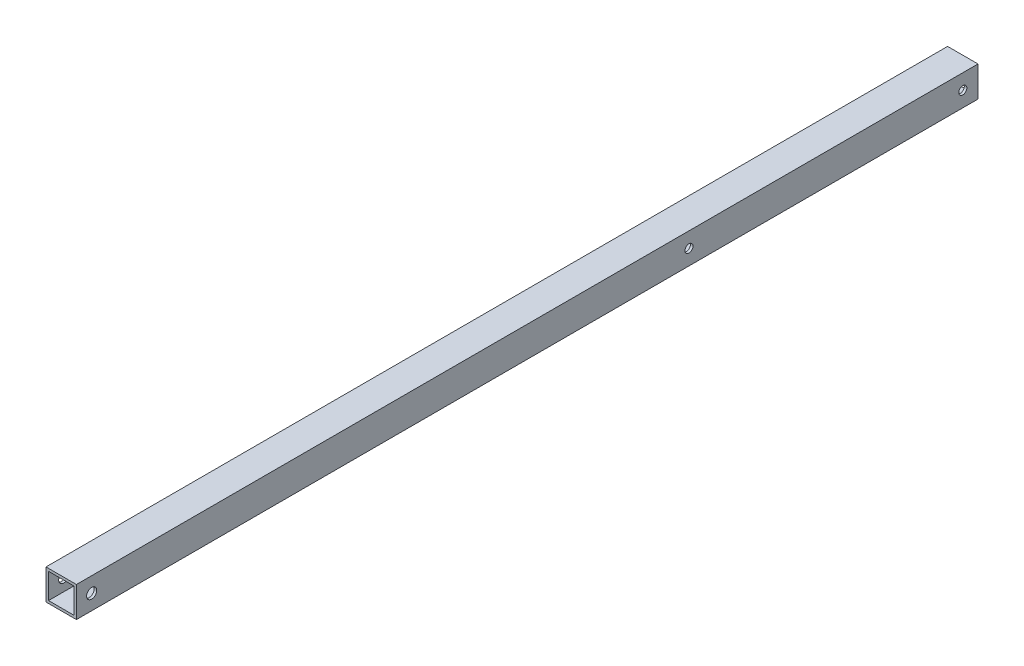
ISO-10303-21;
HEADER;
FILE_DESCRIPTION(('STEP AP214'),'2;1');
FILE_NAME('part.step','',(''),(''),'','','');
FILE_SCHEMA(('AUTOMOTIVE_DESIGN { 1 0 10303 214 1 1 1 1 }'));
ENDSEC;
DATA;
#1=APPLICATION_CONTEXT('core data for automotive mechanical design processes');
#2=APPLICATION_PROTOCOL_DEFINITION('international standard','automotive_design',2000,#1);
#3=PRODUCT_CONTEXT('',#1,'mechanical');
#4=PRODUCT('Part','Part','',(#3));
#5=PRODUCT_RELATED_PRODUCT_CATEGORY('part','',(#4));
#6=PRODUCT_DEFINITION_FORMATION('','',#4);
#7=PRODUCT_DEFINITION_CONTEXT('part definition',#1,'design');
#8=PRODUCT_DEFINITION('design','',#6,#7);
#9=PRODUCT_DEFINITION_SHAPE('','',#8);
#10=(LENGTH_UNIT() NAMED_UNIT(*) SI_UNIT(.MILLI.,.METRE.));
#11=(NAMED_UNIT(*) PLANE_ANGLE_UNIT() SI_UNIT($,.RADIAN.));
#12=(NAMED_UNIT(*) SI_UNIT($,.STERADIAN.) SOLID_ANGLE_UNIT());
#13=UNCERTAINTY_MEASURE_WITH_UNIT(LENGTH_MEASURE(1.E-05),#10,'distance_accuracy_value','');
#14=(GEOMETRIC_REPRESENTATION_CONTEXT(3) GLOBAL_UNCERTAINTY_ASSIGNED_CONTEXT((#13)) GLOBAL_UNIT_ASSIGNED_CONTEXT((#10,
#11,#12)) REPRESENTATION_CONTEXT('',''));
#15=CARTESIAN_POINT('',(0.,0.,0.));
#16=DIRECTION('',(0.,0.,1.));
#17=DIRECTION('',(1.,0.,0.));
#18=AXIS2_PLACEMENT_3D('',#15,#16,#17);
#19=CARTESIAN_POINT('',(0.,0.,1129.03));
#20=DIRECTION('',(0.,0.,-1.));
#21=DIRECTION('',(-1.,0.,0.));
#22=AXIS2_PLACEMENT_3D('',#19,#20,#21);
#23=PLANE('',#22);
#24=DIRECTION('',(0.,-1.,0.));
#25=VECTOR('',#24,1.);
#26=CARTESIAN_POINT('',(0.,0.,1129.03));
#27=LINE('',#26,#25);
#28=CARTESIAN_POINT('',(0.,38.1,1129.03));
#29=VERTEX_POINT('',#28);
#30=CARTESIAN_POINT('',(0.,0.,1129.03));
#31=VERTEX_POINT('',#30);
#32=EDGE_CURVE('E138',#29,#31,#27,.T.);
#33=ORIENTED_EDGE('',*,*,#32,.T.);
#34=DIRECTION('',(1.,0.,0.));
#35=VECTOR('',#34,1.);
#36=CARTESIAN_POINT('',(0.,0.,1129.03));
#37=LINE('',#36,#35);
#38=CARTESIAN_POINT('',(38.1,0.,1129.03));
#39=VERTEX_POINT('',#38);
#40=EDGE_CURVE('E141',#31,#39,#37,.T.);
#41=ORIENTED_EDGE('',*,*,#40,.T.);
#42=DIRECTION('',(0.,1.,0.));
#43=VECTOR('',#42,1.);
#44=CARTESIAN_POINT('',(38.1,0.,1129.03));
#45=LINE('',#44,#43);
#46=CARTESIAN_POINT('',(38.1,38.1,1129.03));
#47=VERTEX_POINT('',#46);
#48=EDGE_CURVE('E144',#39,#47,#45,.T.);
#49=ORIENTED_EDGE('',*,*,#48,.T.);
#50=DIRECTION('',(-1.,0.,0.));
#51=VECTOR('',#50,1.);
#52=CARTESIAN_POINT('',(0.,38.1,1129.03));
#53=LINE('',#52,#51);
#54=EDGE_CURVE('E146',#47,#29,#53,.T.);
#55=ORIENTED_EDGE('',*,*,#54,.T.);
#56=EDGE_LOOP('',(#33,#41,#49,#55));
#57=FACE_BOUND('',#56,.T.);
#58=DIRECTION('',(0.,-1.,0.));
#59=VECTOR('',#58,1.);
#60=CARTESIAN_POINT('',(3.175,3.175,1129.03));
#61=LINE('',#60,#59);
#62=CARTESIAN_POINT('',(3.175,34.925,1129.03));
#63=VERTEX_POINT('',#62);
#64=CARTESIAN_POINT('',(3.175,3.175,1129.03));
#65=VERTEX_POINT('',#64);
#66=EDGE_CURVE('E100',#63,#65,#61,.T.);
#67=ORIENTED_EDGE('',*,*,#66,.F.);
#68=DIRECTION('',(-1.,0.,0.));
#69=VECTOR('',#68,1.);
#70=CARTESIAN_POINT('',(3.175,34.925,1129.03));
#71=LINE('',#70,#69);
#72=CARTESIAN_POINT('',(34.925,34.925,1129.03));
#73=VERTEX_POINT('',#72);
#74=EDGE_CURVE('E122',#73,#63,#71,.T.);
#75=ORIENTED_EDGE('',*,*,#74,.F.);
#76=DIRECTION('',(0.,1.,0.));
#77=VECTOR('',#76,1.);
#78=CARTESIAN_POINT('',(34.925,3.175,1129.03));
#79=LINE('',#78,#77);
#80=CARTESIAN_POINT('',(34.925,3.175,1129.03));
#81=VERTEX_POINT('',#80);
#82=EDGE_CURVE('E120',#81,#73,#79,.T.);
#83=ORIENTED_EDGE('',*,*,#82,.F.);
#84=DIRECTION('',(1.,0.,0.));
#85=VECTOR('',#84,1.);
#86=CARTESIAN_POINT('',(3.175,3.175,1129.03));
#87=LINE('',#86,#85);
#88=EDGE_CURVE('E108',#65,#81,#87,.T.);
#89=ORIENTED_EDGE('',*,*,#88,.F.);
#90=EDGE_LOOP('',(#67,#75,#83,#89));
#91=FACE_BOUND('',#90,.T.);
#92=ADVANCED_FACE('F33',(#57,#91),#23,.F.);
#93=CARTESIAN_POINT('',(0.,0.,0.));
#94=DIRECTION('',(0.,0.,-1.));
#95=DIRECTION('',(-1.,0.,0.));
#96=AXIS2_PLACEMENT_3D('',#93,#94,#95);
#97=PLANE('',#96);
#98=DIRECTION('',(0.,-1.,0.));
#99=VECTOR('',#98,1.);
#100=CARTESIAN_POINT('',(0.,0.,0.));
#101=LINE('',#100,#99);
#102=CARTESIAN_POINT('',(0.,38.1,0.));
#103=VERTEX_POINT('',#102);
#104=CARTESIAN_POINT('',(0.,0.,0.));
#105=VERTEX_POINT('',#104);
#106=EDGE_CURVE('E116',#103,#105,#101,.T.);
#107=ORIENTED_EDGE('',*,*,#106,.F.);
#108=DIRECTION('',(-1.,0.,0.));
#109=VECTOR('',#108,1.);
#110=CARTESIAN_POINT('',(0.,38.1,0.));
#111=LINE('',#110,#109);
#112=CARTESIAN_POINT('',(38.1,38.1,0.));
#113=VERTEX_POINT('',#112);
#114=EDGE_CURVE('E142',#113,#103,#111,.T.);
#115=ORIENTED_EDGE('',*,*,#114,.F.);
#116=DIRECTION('',(0.,1.,0.));
#117=VECTOR('',#116,1.);
#118=CARTESIAN_POINT('',(38.1,0.,0.));
#119=LINE('',#118,#117);
#120=CARTESIAN_POINT('',(38.1,0.,0.));
#121=VERTEX_POINT('',#120);
#122=EDGE_CURVE('E153',#121,#113,#119,.T.);
#123=ORIENTED_EDGE('',*,*,#122,.F.);
#124=DIRECTION('',(1.,0.,0.));
#125=VECTOR('',#124,1.);
#126=CARTESIAN_POINT('',(0.,0.,0.));
#127=LINE('',#126,#125);
#128=EDGE_CURVE('E151',#105,#121,#127,.T.);
#129=ORIENTED_EDGE('',*,*,#128,.F.);
#130=EDGE_LOOP('',(#107,#115,#123,#129));
#131=FACE_BOUND('',#130,.T.);
#132=DIRECTION('',(-1.,0.,0.));
#133=VECTOR('',#132,1.);
#134=CARTESIAN_POINT('',(3.175,34.925,0.));
#135=LINE('',#134,#133);
#136=CARTESIAN_POINT('',(34.925,34.925,0.));
#137=VERTEX_POINT('',#136);
#138=CARTESIAN_POINT('',(3.175,34.925,0.));
#139=VERTEX_POINT('',#138);
#140=EDGE_CURVE('E109',#137,#139,#135,.T.);
#141=ORIENTED_EDGE('',*,*,#140,.T.);
#142=DIRECTION('',(0.,-1.,0.));
#143=VECTOR('',#142,1.);
#144=CARTESIAN_POINT('',(3.175,3.175,0.));
#145=LINE('',#144,#143);
#146=CARTESIAN_POINT('',(3.175,3.175,0.));
#147=VERTEX_POINT('',#146);
#148=EDGE_CURVE('E58',#139,#147,#145,.T.);
#149=ORIENTED_EDGE('',*,*,#148,.T.);
#150=DIRECTION('',(1.,0.,0.));
#151=VECTOR('',#150,1.);
#152=CARTESIAN_POINT('',(3.175,3.175,0.));
#153=LINE('',#152,#151);
#154=CARTESIAN_POINT('',(34.925,3.175,0.));
#155=VERTEX_POINT('',#154);
#156=EDGE_CURVE('E115',#147,#155,#153,.T.);
#157=ORIENTED_EDGE('',*,*,#156,.T.);
#158=DIRECTION('',(0.,1.,0.));
#159=VECTOR('',#158,1.);
#160=CARTESIAN_POINT('',(34.925,3.175,0.));
#161=LINE('',#160,#159);
#162=EDGE_CURVE('E130',#155,#137,#161,.T.);
#163=ORIENTED_EDGE('',*,*,#162,.T.);
#164=EDGE_LOOP('',(#141,#149,#157,#163));
#165=FACE_BOUND('',#164,.T.);
#166=ADVANCED_FACE('F211',(#131,#165),#97,.T.);
#167=CARTESIAN_POINT('',(0.,0.,1129.03));
#168=DIRECTION('',(1.,0.,0.));
#169=DIRECTION('',(0.,0.,-1.));
#170=AXIS2_PLACEMENT_3D('',#167,#168,#169);
#171=PLANE('',#170);
#172=CARTESIAN_POINT('',(0.,19.05,1109.98));
#173=DIRECTION('',(-1.,0.,0.));
#174=DIRECTION('',(0.,0.,1.));
#175=AXIS2_PLACEMENT_3D('',#172,#173,#174);
#176=CIRCLE('',#175,6.34999999999999);
#177=CARTESIAN_POINT('',(0.,19.05,1116.33));
#178=VERTEX_POINT('',#177);
#179=EDGE_CURVE('E275',#178,#178,#176,.T.);
#180=ORIENTED_EDGE('',*,*,#179,.F.);
#181=EDGE_LOOP('',(#180));
#182=FACE_BOUND('',#181,.T.);
#183=CARTESIAN_POINT('',(0.,19.05,19.05));
#184=DIRECTION('',(-1.,0.,0.));
#185=DIRECTION('',(0.,0.,1.));
#186=AXIS2_PLACEMENT_3D('',#183,#184,#185);
#187=CIRCLE('',#186,5.04189999999999);
#188=CARTESIAN_POINT('',(0.,19.05,24.0919));
#189=VERTEX_POINT('',#188);
#190=EDGE_CURVE('E176',#189,#189,#187,.T.);
#191=ORIENTED_EDGE('',*,*,#190,.F.);
#192=EDGE_LOOP('',(#191));
#193=FACE_BOUND('',#192,.T.);
#194=CARTESIAN_POINT('',(0.,19.05,361.95));
#195=DIRECTION('',(-1.,0.,0.));
#196=DIRECTION('',(0.,0.,1.));
#197=AXIS2_PLACEMENT_3D('',#194,#195,#196);
#198=CIRCLE('',#197,5.04189999999999);
#199=CARTESIAN_POINT('',(0.,19.05,366.9919));
#200=VERTEX_POINT('',#199);
#201=EDGE_CURVE('E173',#200,#200,#198,.T.);
#202=ORIENTED_EDGE('',*,*,#201,.F.);
#203=EDGE_LOOP('',(#202));
#204=FACE_BOUND('',#203,.T.);
#205=ORIENTED_EDGE('',*,*,#106,.T.);
#206=DIRECTION('',(0.,0.,-1.));
#207=VECTOR('',#206,1.);
#208=CARTESIAN_POINT('',(0.,0.,1129.03));
#209=LINE('',#208,#207);
#210=EDGE_CURVE('E11',#31,#105,#209,.T.);
#211=ORIENTED_EDGE('',*,*,#210,.F.);
#212=ORIENTED_EDGE('',*,*,#32,.F.);
#213=DIRECTION('',(0.,0.,-1.));
#214=VECTOR('',#213,1.);
#215=CARTESIAN_POINT('',(0.,38.1,1129.03));
#216=LINE('',#215,#214);
#217=EDGE_CURVE('E148',#29,#103,#216,.T.);
#218=ORIENTED_EDGE('',*,*,#217,.T.);
#219=EDGE_LOOP('',(#205,#211,#212,#218));
#220=FACE_BOUND('',#219,.T.);
#221=ADVANCED_FACE('F35',(#182,#193,#204,#220),#171,.F.);
#222=CARTESIAN_POINT('',(0.,0.,1129.03));
#223=DIRECTION('',(0.,1.,0.));
#224=DIRECTION('',(0.,0.,1.));
#225=AXIS2_PLACEMENT_3D('',#222,#223,#224);
#226=PLANE('',#225);
#227=ORIENTED_EDGE('',*,*,#128,.T.);
#228=DIRECTION('',(0.,0.,-1.));
#229=VECTOR('',#228,1.);
#230=CARTESIAN_POINT('',(38.1,0.,1129.03));
#231=LINE('',#230,#229);
#232=EDGE_CURVE('E42',#39,#121,#231,.T.);
#233=ORIENTED_EDGE('',*,*,#232,.F.);
#234=ORIENTED_EDGE('',*,*,#40,.F.);
#235=ORIENTED_EDGE('',*,*,#210,.T.);
#236=EDGE_LOOP('',(#227,#233,#234,#235));
#237=FACE_BOUND('',#236,.T.);
#238=ADVANCED_FACE('F220',(#237),#226,.F.);
#239=CARTESIAN_POINT('',(38.1,0.,1129.03));
#240=DIRECTION('',(-1.,0.,0.));
#241=DIRECTION('',(0.,0.,1.));
#242=AXIS2_PLACEMENT_3D('',#239,#240,#241);
#243=PLANE('',#242);
#244=CARTESIAN_POINT('',(38.1,19.05,1109.98));
#245=DIRECTION('',(-1.,0.,0.));
#246=DIRECTION('',(0.,0.,1.));
#247=AXIS2_PLACEMENT_3D('',#244,#245,#246);
#248=CIRCLE('',#247,6.34999999999998);
#249=CARTESIAN_POINT('',(38.1,19.05,1116.33));
#250=VERTEX_POINT('',#249);
#251=EDGE_CURVE('E274',#250,#250,#248,.T.);
#252=ORIENTED_EDGE('',*,*,#251,.T.);
#253=EDGE_LOOP('',(#252));
#254=FACE_BOUND('',#253,.T.);
#255=CARTESIAN_POINT('',(38.1,19.05,19.05));
#256=DIRECTION('',(-1.,0.,0.));
#257=DIRECTION('',(0.,0.,1.));
#258=AXIS2_PLACEMENT_3D('',#255,#256,#257);
#259=CIRCLE('',#258,5.04189999999999);
#260=CARTESIAN_POINT('',(38.1,19.05,24.0919));
#261=VERTEX_POINT('',#260);
#262=EDGE_CURVE('E169',#261,#261,#259,.T.);
#263=ORIENTED_EDGE('',*,*,#262,.T.);
#264=EDGE_LOOP('',(#263));
#265=FACE_BOUND('',#264,.T.);
#266=CARTESIAN_POINT('',(38.1,19.05,361.95));
#267=DIRECTION('',(-1.,0.,0.));
#268=DIRECTION('',(0.,0.,1.));
#269=AXIS2_PLACEMENT_3D('',#266,#267,#268);
#270=CIRCLE('',#269,5.04189999999999);
#271=CARTESIAN_POINT('',(38.1,19.05,366.9919));
#272=VERTEX_POINT('',#271);
#273=EDGE_CURVE('E165',#272,#272,#270,.T.);
#274=ORIENTED_EDGE('',*,*,#273,.T.);
#275=EDGE_LOOP('',(#274));
#276=FACE_BOUND('',#275,.T.);
#277=ORIENTED_EDGE('',*,*,#122,.T.);
#278=DIRECTION('',(0.,0.,-1.));
#279=VECTOR('',#278,1.);
#280=CARTESIAN_POINT('',(38.1,38.1,1129.03));
#281=LINE('',#280,#279);
#282=EDGE_CURVE('E158',#47,#113,#281,.T.);
#283=ORIENTED_EDGE('',*,*,#282,.F.);
#284=ORIENTED_EDGE('',*,*,#48,.F.);
#285=ORIENTED_EDGE('',*,*,#232,.T.);
#286=EDGE_LOOP('',(#277,#283,#284,#285));
#287=FACE_BOUND('',#286,.T.);
#288=ADVANCED_FACE('F204',(#254,#265,#276,#287),#243,.F.);
#289=CARTESIAN_POINT('',(0.,38.1,1129.03));
#290=DIRECTION('',(0.,-1.,0.));
#291=DIRECTION('',(0.,0.,-1.));
#292=AXIS2_PLACEMENT_3D('',#289,#290,#291);
#293=PLANE('',#292);
#294=ORIENTED_EDGE('',*,*,#114,.T.);
#295=ORIENTED_EDGE('',*,*,#217,.F.);
#296=ORIENTED_EDGE('',*,*,#54,.F.);
#297=ORIENTED_EDGE('',*,*,#282,.T.);
#298=EDGE_LOOP('',(#294,#295,#296,#297));
#299=FACE_BOUND('',#298,.T.);
#300=ADVANCED_FACE('F195',(#299),#293,.F.);
#301=CARTESIAN_POINT('',(3.175,3.175,1129.03));
#302=DIRECTION('',(1.,0.,0.));
#303=DIRECTION('',(0.,1.,0.));
#304=AXIS2_PLACEMENT_3D('',#301,#302,#303);
#305=PLANE('',#304);
#306=CARTESIAN_POINT('',(3.175,19.05,1109.98));
#307=DIRECTION('',(1.,0.,0.));
#308=DIRECTION('',(0.,1.,0.));
#309=AXIS2_PLACEMENT_3D('',#306,#307,#308);
#310=CIRCLE('',#309,6.34999999999999);
#311=CARTESIAN_POINT('',(3.175,25.4,1109.98));
#312=VERTEX_POINT('',#311);
#313=EDGE_CURVE('E181',#312,#312,#310,.T.);
#314=ORIENTED_EDGE('',*,*,#313,.F.);
#315=EDGE_LOOP('',(#314));
#316=FACE_BOUND('',#315,.T.);
#317=CARTESIAN_POINT('',(3.175,19.05,19.05));
#318=DIRECTION('',(1.,0.,0.));
#319=DIRECTION('',(0.,1.,0.));
#320=AXIS2_PLACEMENT_3D('',#317,#318,#319);
#321=CIRCLE('',#320,5.04189999999999);
#322=CARTESIAN_POINT('',(3.175,24.0919,19.05));
#323=VERTEX_POINT('',#322);
#324=EDGE_CURVE('E168',#323,#323,#321,.T.);
#325=ORIENTED_EDGE('',*,*,#324,.F.);
#326=EDGE_LOOP('',(#325));
#327=FACE_BOUND('',#326,.T.);
#328=CARTESIAN_POINT('',(3.175,19.05,361.95));
#329=DIRECTION('',(1.,0.,0.));
#330=DIRECTION('',(0.,1.,0.));
#331=AXIS2_PLACEMENT_3D('',#328,#329,#330);
#332=CIRCLE('',#331,5.04189999999999);
#333=CARTESIAN_POINT('',(3.175,24.0919,361.95));
#334=VERTEX_POINT('',#333);
#335=EDGE_CURVE('E128',#334,#334,#332,.T.);
#336=ORIENTED_EDGE('',*,*,#335,.F.);
#337=EDGE_LOOP('',(#336));
#338=FACE_BOUND('',#337,.T.);
#339=ORIENTED_EDGE('',*,*,#148,.F.);
#340=DIRECTION('',(0.,0.,-1.));
#341=VECTOR('',#340,1.);
#342=CARTESIAN_POINT('',(3.175,34.925,1129.03));
#343=LINE('',#342,#341);
#344=EDGE_CURVE('E104',#63,#139,#343,.T.);
#345=ORIENTED_EDGE('',*,*,#344,.F.);
#346=ORIENTED_EDGE('',*,*,#66,.T.);
#347=DIRECTION('',(0.,0.,-1.));
#348=VECTOR('',#347,1.);
#349=CARTESIAN_POINT('',(3.175,3.175,1129.03));
#350=LINE('',#349,#348);
#351=EDGE_CURVE('E103',#65,#147,#350,.T.);
#352=ORIENTED_EDGE('',*,*,#351,.T.);
#353=EDGE_LOOP('',(#339,#345,#346,#352));
#354=FACE_BOUND('',#353,.T.);
#355=ADVANCED_FACE('F102',(#316,#327,#338,#354),#305,.T.);
#356=CARTESIAN_POINT('',(3.175,3.175,1129.03));
#357=DIRECTION('',(0.,1.,0.));
#358=DIRECTION('',(0.,0.,1.));
#359=AXIS2_PLACEMENT_3D('',#356,#357,#358);
#360=PLANE('',#359);
#361=ORIENTED_EDGE('',*,*,#156,.F.);
#362=ORIENTED_EDGE('',*,*,#351,.F.);
#363=ORIENTED_EDGE('',*,*,#88,.T.);
#364=DIRECTION('',(0.,0.,-1.));
#365=VECTOR('',#364,1.);
#366=CARTESIAN_POINT('',(34.925,3.175,1129.03));
#367=LINE('',#366,#365);
#368=EDGE_CURVE('E117',#81,#155,#367,.T.);
#369=ORIENTED_EDGE('',*,*,#368,.T.);
#370=EDGE_LOOP('',(#361,#362,#363,#369));
#371=FACE_BOUND('',#370,.T.);
#372=ADVANCED_FACE('F112',(#371),#360,.T.);
#373=CARTESIAN_POINT('',(34.925,3.175,1129.03));
#374=DIRECTION('',(-1.,0.,0.));
#375=DIRECTION('',(0.,0.,1.));
#376=AXIS2_PLACEMENT_3D('',#373,#374,#375);
#377=PLANE('',#376);
#378=CARTESIAN_POINT('',(34.925,19.05,1109.98));
#379=DIRECTION('',(-1.,0.,0.));
#380=DIRECTION('',(0.,0.,1.));
#381=AXIS2_PLACEMENT_3D('',#378,#379,#380);
#382=CIRCLE('',#381,6.34999999999999);
#383=CARTESIAN_POINT('',(34.925,19.05,1116.33));
#384=VERTEX_POINT('',#383);
#385=EDGE_CURVE('E37',#384,#384,#382,.T.);
#386=ORIENTED_EDGE('',*,*,#385,.F.);
#387=EDGE_LOOP('',(#386));
#388=FACE_BOUND('',#387,.T.);
#389=CARTESIAN_POINT('',(34.925,19.05,19.05));
#390=DIRECTION('',(-1.,0.,0.));
#391=DIRECTION('',(0.,0.,1.));
#392=AXIS2_PLACEMENT_3D('',#389,#390,#391);
#393=CIRCLE('',#392,5.04189999999999);
#394=CARTESIAN_POINT('',(34.925,19.05,24.0919));
#395=VERTEX_POINT('',#394);
#396=EDGE_CURVE('E166',#395,#395,#393,.T.);
#397=ORIENTED_EDGE('',*,*,#396,.F.);
#398=EDGE_LOOP('',(#397));
#399=FACE_BOUND('',#398,.T.);
#400=CARTESIAN_POINT('',(34.925,19.05,361.95));
#401=DIRECTION('',(-1.,0.,0.));
#402=DIRECTION('',(0.,0.,1.));
#403=AXIS2_PLACEMENT_3D('',#400,#401,#402);
#404=CIRCLE('',#403,5.04189999999999);
#405=CARTESIAN_POINT('',(34.925,19.05,366.9919));
#406=VERTEX_POINT('',#405);
#407=EDGE_CURVE('E163',#406,#406,#404,.T.);
#408=ORIENTED_EDGE('',*,*,#407,.F.);
#409=EDGE_LOOP('',(#408));
#410=FACE_BOUND('',#409,.T.);
#411=ORIENTED_EDGE('',*,*,#162,.F.);
#412=ORIENTED_EDGE('',*,*,#368,.F.);
#413=ORIENTED_EDGE('',*,*,#82,.T.);
#414=DIRECTION('',(0.,0.,-1.));
#415=VECTOR('',#414,1.);
#416=CARTESIAN_POINT('',(34.925,34.925,1129.03));
#417=LINE('',#416,#415);
#418=EDGE_CURVE('E50',#73,#137,#417,.T.);
#419=ORIENTED_EDGE('',*,*,#418,.T.);
#420=EDGE_LOOP('',(#411,#412,#413,#419));
#421=FACE_BOUND('',#420,.T.);
#422=ADVANCED_FACE('F202',(#388,#399,#410,#421),#377,.T.);
#423=CARTESIAN_POINT('',(3.175,34.925,1129.03));
#424=DIRECTION('',(0.,-1.,0.));
#425=DIRECTION('',(0.,0.,-1.));
#426=AXIS2_PLACEMENT_3D('',#423,#424,#425);
#427=PLANE('',#426);
#428=ORIENTED_EDGE('',*,*,#140,.F.);
#429=ORIENTED_EDGE('',*,*,#418,.F.);
#430=ORIENTED_EDGE('',*,*,#74,.T.);
#431=ORIENTED_EDGE('',*,*,#344,.T.);
#432=EDGE_LOOP('',(#428,#429,#430,#431));
#433=FACE_BOUND('',#432,.T.);
#434=ADVANCED_FACE('F242',(#433),#427,.T.);
#435=CARTESIAN_POINT('',(0.,19.05,361.95));
#436=DIRECTION('',(-1.,0.,0.));
#437=DIRECTION('',(0.,0.,1.));
#438=AXIS2_PLACEMENT_3D('',#435,#436,#437);
#439=CYLINDRICAL_SURFACE('',#438,5.04189999999999);
#440=ORIENTED_EDGE('',*,*,#407,.T.);
#441=EDGE_LOOP('',(#440));
#442=FACE_BOUND('',#441,.T.);
#443=ORIENTED_EDGE('',*,*,#273,.F.);
#444=EDGE_LOOP('',(#443));
#445=FACE_BOUND('',#444,.T.);
#446=ADVANCED_FACE('F244',(#442,#445),#439,.F.);
#447=ORIENTED_EDGE('',*,*,#335,.T.);
#448=EDGE_LOOP('',(#447));
#449=FACE_BOUND('',#448,.T.);
#450=ORIENTED_EDGE('',*,*,#201,.T.);
#451=EDGE_LOOP('',(#450));
#452=FACE_BOUND('',#451,.T.);
#453=ADVANCED_FACE('F191',(#449,#452),#439,.F.);
#454=CARTESIAN_POINT('',(0.,19.05,19.05));
#455=DIRECTION('',(-1.,0.,0.));
#456=DIRECTION('',(0.,0.,1.));
#457=AXIS2_PLACEMENT_3D('',#454,#455,#456);
#458=CYLINDRICAL_SURFACE('',#457,5.04189999999999);
#459=ORIENTED_EDGE('',*,*,#396,.T.);
#460=EDGE_LOOP('',(#459));
#461=FACE_BOUND('',#460,.T.);
#462=ORIENTED_EDGE('',*,*,#262,.F.);
#463=EDGE_LOOP('',(#462));
#464=FACE_BOUND('',#463,.T.);
#465=ADVANCED_FACE('F255',(#461,#464),#458,.F.);
#466=ORIENTED_EDGE('',*,*,#324,.T.);
#467=EDGE_LOOP('',(#466));
#468=FACE_BOUND('',#467,.T.);
#469=ORIENTED_EDGE('',*,*,#190,.T.);
#470=EDGE_LOOP('',(#469));
#471=FACE_BOUND('',#470,.T.);
#472=ADVANCED_FACE('F258',(#468,#471),#458,.F.);
#473=CARTESIAN_POINT('',(0.,19.05,1109.98));
#474=DIRECTION('',(-1.,0.,0.));
#475=DIRECTION('',(0.,0.,1.));
#476=AXIS2_PLACEMENT_3D('',#473,#474,#475);
#477=CYLINDRICAL_SURFACE('',#476,6.34999999999999);
#478=ORIENTED_EDGE('',*,*,#385,.T.);
#479=EDGE_LOOP('',(#478));
#480=FACE_BOUND('',#479,.T.);
#481=ORIENTED_EDGE('',*,*,#251,.F.);
#482=EDGE_LOOP('',(#481));
#483=FACE_BOUND('',#482,.T.);
#484=ADVANCED_FACE('F259',(#480,#483),#477,.F.);
#485=ORIENTED_EDGE('',*,*,#313,.T.);
#486=EDGE_LOOP('',(#485));
#487=FACE_BOUND('',#486,.T.);
#488=ORIENTED_EDGE('',*,*,#179,.T.);
#489=EDGE_LOOP('',(#488));
#490=FACE_BOUND('',#489,.T.);
#491=ADVANCED_FACE('F261',(#487,#490),#477,.F.);
#492=CLOSED_SHELL('',(#92,#166,#221,#238,#288,#300,#355,#372,#422,#434,#446,#453,#465,#472,#484,#491));
#493=MANIFOLD_SOLID_BREP('B2',#492);
#494=ADVANCED_BREP_SHAPE_REPRESENTATION('',(#18,#493),#14);
#495=SHAPE_DEFINITION_REPRESENTATION(#9,#494);
ENDSEC;
END-ISO-10303-21;
